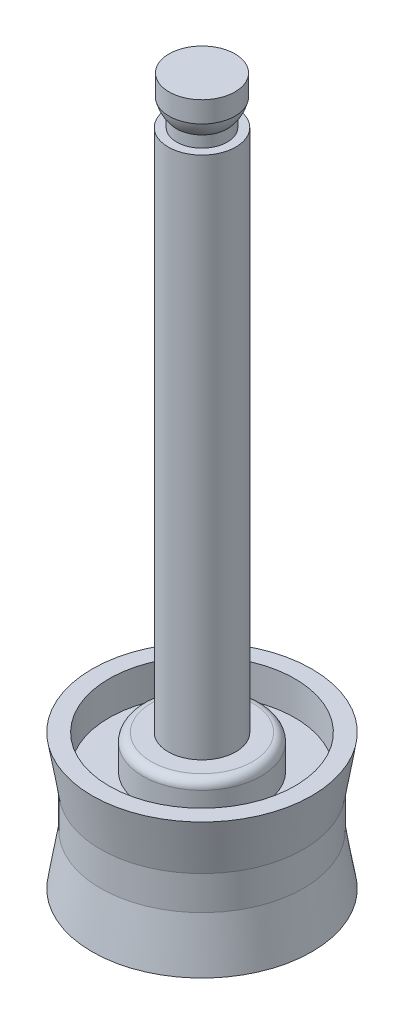
ISO-10303-21;
HEADER;
FILE_DESCRIPTION(('STEP AP214'),'2;1');
FILE_NAME('part.step','',(''),(''),'','','');
FILE_SCHEMA(('AUTOMOTIVE_DESIGN { 1 0 10303 214 1 1 1 1 }'));
ENDSEC;
DATA;
#1=APPLICATION_CONTEXT('core data for automotive mechanical design processes');
#2=APPLICATION_PROTOCOL_DEFINITION('international standard','automotive_design',2000,#1);
#3=PRODUCT_CONTEXT('',#1,'mechanical');
#4=PRODUCT('Part','Part','',(#3));
#5=PRODUCT_RELATED_PRODUCT_CATEGORY('part','',(#4));
#6=PRODUCT_DEFINITION_FORMATION('','',#4);
#7=PRODUCT_DEFINITION_CONTEXT('part definition',#1,'design');
#8=PRODUCT_DEFINITION('design','',#6,#7);
#9=PRODUCT_DEFINITION_SHAPE('','',#8);
#10=(LENGTH_UNIT() NAMED_UNIT(*) SI_UNIT(.MILLI.,.METRE.));
#11=(NAMED_UNIT(*) PLANE_ANGLE_UNIT() SI_UNIT($,.RADIAN.));
#12=(NAMED_UNIT(*) SI_UNIT($,.STERADIAN.) SOLID_ANGLE_UNIT());
#13=UNCERTAINTY_MEASURE_WITH_UNIT(LENGTH_MEASURE(1.E-05),#10,'distance_accuracy_value','');
#14=(GEOMETRIC_REPRESENTATION_CONTEXT(3) GLOBAL_UNCERTAINTY_ASSIGNED_CONTEXT((#13)) GLOBAL_UNIT_ASSIGNED_CONTEXT((#10,
#11,#12)) REPRESENTATION_CONTEXT('',''));
#15=CARTESIAN_POINT('',(0.,0.,0.));
#16=DIRECTION('',(0.,0.,1.));
#17=DIRECTION('',(1.,0.,0.));
#18=AXIS2_PLACEMENT_3D('',#15,#16,#17);
#19=CARTESIAN_POINT('',(0.,8.,0.));
#20=DIRECTION('',(0.,1.,0.));
#21=DIRECTION('',(0.,0.,1.));
#22=AXIS2_PLACEMENT_3D('',#19,#20,#21);
#23=PLANE('',#22);
#24=CARTESIAN_POINT('',(0.,8.,0.));
#25=DIRECTION('',(0.,1.,0.));
#26=DIRECTION('',(0.,0.,1.));
#27=AXIS2_PLACEMENT_3D('',#24,#25,#26);
#28=CIRCLE('',#27,5.5);
#29=CARTESIAN_POINT('',(0.,8.,5.5));
#30=VERTEX_POINT('',#29);
#31=EDGE_CURVE('E94',#30,#30,#28,.T.);
#32=ORIENTED_EDGE('',*,*,#31,.F.);
#33=EDGE_LOOP('',(#32));
#34=FACE_BOUND('',#33,.T.);
#35=CARTESIAN_POINT('',(0.,8.,0.));
#36=DIRECTION('',(0.,-1.,0.));
#37=DIRECTION('',(0.,0.,-1.));
#38=AXIS2_PLACEMENT_3D('',#35,#36,#37);
#39=CIRCLE('',#38,6.5);
#40=CARTESIAN_POINT('',(0.,8.,-6.5));
#41=VERTEX_POINT('',#40);
#42=EDGE_CURVE('E72',#41,#41,#39,.T.);
#43=ORIENTED_EDGE('',*,*,#42,.F.);
#44=EDGE_LOOP('',(#43));
#45=FACE_BOUND('',#44,.T.);
#46=ADVANCED_FACE('F34',(#34,#45),#23,.T.);
#47=CARTESIAN_POINT('',(0.,5.,0.));
#48=DIRECTION('',(0.,1.,0.));
#49=DIRECTION('',(0.,0.,1.));
#50=AXIS2_PLACEMENT_3D('',#47,#48,#49);
#51=CONICAL_SURFACE('',#50,6.,0.165148677414627);
#52=ORIENTED_EDGE('',*,*,#42,.T.);
#53=EDGE_LOOP('',(#52));
#54=FACE_BOUND('',#53,.T.);
#55=CARTESIAN_POINT('',(0.,5.,0.));
#56=DIRECTION('',(0.,-1.,0.));
#57=DIRECTION('',(0.,0.,-1.));
#58=AXIS2_PLACEMENT_3D('',#55,#56,#57);
#59=CIRCLE('',#58,6.);
#60=CARTESIAN_POINT('',(0.,5.,-6.));
#61=VERTEX_POINT('',#60);
#62=EDGE_CURVE('E81',#61,#61,#59,.T.);
#63=ORIENTED_EDGE('',*,*,#62,.F.);
#64=EDGE_LOOP('',(#63));
#65=FACE_BOUND('',#64,.T.);
#66=ADVANCED_FACE('F120',(#54,#65),#51,.T.);
#67=CARTESIAN_POINT('',(0.,0.,0.));
#68=DIRECTION('',(0.,-1.,0.));
#69=DIRECTION('',(0.,0.,-1.));
#70=AXIS2_PLACEMENT_3D('',#67,#68,#69);
#71=CONICAL_SURFACE('',#70,6.5,0.165148677414627);
#72=CARTESIAN_POINT('',(0.,3.,0.));
#73=DIRECTION('',(0.,-1.,0.));
#74=DIRECTION('',(0.,0.,-1.));
#75=AXIS2_PLACEMENT_3D('',#72,#73,#74);
#76=CIRCLE('',#75,6.);
#77=CARTESIAN_POINT('',(0.,3.,-6.));
#78=VERTEX_POINT('',#77);
#79=EDGE_CURVE('E78',#78,#78,#76,.T.);
#80=ORIENTED_EDGE('',*,*,#79,.T.);
#81=EDGE_LOOP('',(#80));
#82=FACE_BOUND('',#81,.T.);
#83=CARTESIAN_POINT('',(0.,0.,0.));
#84=DIRECTION('',(0.,-1.,0.));
#85=DIRECTION('',(0.,0.,-1.));
#86=AXIS2_PLACEMENT_3D('',#83,#84,#85);
#87=CIRCLE('',#86,6.5);
#88=CARTESIAN_POINT('',(0.,0.,-6.5));
#89=VERTEX_POINT('',#88);
#90=EDGE_CURVE('E75',#89,#89,#87,.T.);
#91=ORIENTED_EDGE('',*,*,#90,.F.);
#92=EDGE_LOOP('',(#91));
#93=FACE_BOUND('',#92,.T.);
#94=ADVANCED_FACE('F127',(#82,#93),#71,.T.);
#95=CARTESIAN_POINT('',(0.,0.,0.));
#96=DIRECTION('',(0.,-1.,0.));
#97=DIRECTION('',(0.,0.,-1.));
#98=AXIS2_PLACEMENT_3D('',#95,#96,#97);
#99=CYLINDRICAL_SURFACE('',#98,6.);
#100=ORIENTED_EDGE('',*,*,#62,.T.);
#101=EDGE_LOOP('',(#100));
#102=FACE_BOUND('',#101,.T.);
#103=ORIENTED_EDGE('',*,*,#79,.F.);
#104=EDGE_LOOP('',(#103));
#105=FACE_BOUND('',#104,.T.);
#106=ADVANCED_FACE('F131',(#102,#105),#99,.T.);
#107=CARTESIAN_POINT('',(0.,0.,0.));
#108=DIRECTION('',(0.,1.,0.));
#109=DIRECTION('',(0.,0.,1.));
#110=AXIS2_PLACEMENT_3D('',#107,#108,#109);
#111=PLANE('',#110);
#112=CARTESIAN_POINT('',(0.,0.,0.));
#113=DIRECTION('',(0.,-1.,0.));
#114=DIRECTION('',(0.,0.,-1.));
#115=AXIS2_PLACEMENT_3D('',#112,#113,#114);
#116=CIRCLE('',#115,5.5);
#117=CARTESIAN_POINT('',(0.,0.,-5.5));
#118=VERTEX_POINT('',#117);
#119=EDGE_CURVE('E85',#118,#118,#116,.T.);
#120=ORIENTED_EDGE('',*,*,#119,.F.);
#121=EDGE_LOOP('',(#120));
#122=FACE_BOUND('',#121,.T.);
#123=ORIENTED_EDGE('',*,*,#90,.T.);
#124=EDGE_LOOP('',(#123));
#125=FACE_BOUND('',#124,.T.);
#126=ADVANCED_FACE('F134',(#122,#125),#111,.F.);
#127=CARTESIAN_POINT('',(0.,2.,0.));
#128=DIRECTION('',(0.,-1.,0.));
#129=DIRECTION('',(0.,0.,-1.));
#130=AXIS2_PLACEMENT_3D('',#127,#128,#129);
#131=CYLINDRICAL_SURFACE('',#130,5.5);
#132=CARTESIAN_POINT('',(0.,2.,0.));
#133=DIRECTION('',(0.,-1.,0.));
#134=DIRECTION('',(0.,0.,-1.));
#135=AXIS2_PLACEMENT_3D('',#132,#133,#134);
#136=CIRCLE('',#135,5.5);
#137=CARTESIAN_POINT('',(0.,2.,-5.5));
#138=VERTEX_POINT('',#137);
#139=EDGE_CURVE('E84',#138,#138,#136,.T.);
#140=ORIENTED_EDGE('',*,*,#139,.F.);
#141=EDGE_LOOP('',(#140));
#142=FACE_BOUND('',#141,.T.);
#143=ORIENTED_EDGE('',*,*,#119,.T.);
#144=EDGE_LOOP('',(#143));
#145=FACE_BOUND('',#144,.T.);
#146=ADVANCED_FACE('F144',(#142,#145),#131,.F.);
#147=CARTESIAN_POINT('',(0.,2.,0.));
#148=DIRECTION('',(0.,-1.,0.));
#149=DIRECTION('',(0.,0.,-1.));
#150=AXIS2_PLACEMENT_3D('',#147,#148,#149);
#151=PLANE('',#150);
#152=CARTESIAN_POINT('',(0.,2.,0.));
#153=DIRECTION('',(0.,-1.,0.));
#154=DIRECTION('',(0.,0.,-1.));
#155=AXIS2_PLACEMENT_3D('',#152,#153,#154);
#156=CIRCLE('',#155,3.5);
#157=CARTESIAN_POINT('',(0.,2.,-3.5));
#158=VERTEX_POINT('',#157);
#159=EDGE_CURVE('E88',#158,#158,#156,.T.);
#160=ORIENTED_EDGE('',*,*,#159,.F.);
#161=EDGE_LOOP('',(#160));
#162=FACE_BOUND('',#161,.T.);
#163=ORIENTED_EDGE('',*,*,#139,.T.);
#164=EDGE_LOOP('',(#163));
#165=FACE_BOUND('',#164,.T.);
#166=ADVANCED_FACE('F150',(#162,#165),#151,.T.);
#167=CARTESIAN_POINT('',(0.,2.,0.));
#168=DIRECTION('',(0.,-1.,0.));
#169=DIRECTION('',(0.,0.,-1.));
#170=AXIS2_PLACEMENT_3D('',#167,#168,#169);
#171=CYLINDRICAL_SURFACE('',#170,3.5);
#172=CARTESIAN_POINT('',(0.,0.5,0.));
#173=DIRECTION('',(0.,1.,0.));
#174=DIRECTION('',(0.,0.,1.));
#175=AXIS2_PLACEMENT_3D('',#172,#173,#174);
#176=CIRCLE('',#175,3.5);
#177=CARTESIAN_POINT('',(0.,0.5,3.5));
#178=VERTEX_POINT('',#177);
#179=EDGE_CURVE('E45',#178,#178,#176,.T.);
#180=ORIENTED_EDGE('',*,*,#179,.T.);
#181=EDGE_LOOP('',(#180));
#182=FACE_BOUND('',#181,.T.);
#183=ORIENTED_EDGE('',*,*,#159,.T.);
#184=EDGE_LOOP('',(#183));
#185=FACE_BOUND('',#184,.T.);
#186=ADVANCED_FACE('F155',(#182,#185),#171,.T.);
#187=CARTESIAN_POINT('',(0.,0.,0.));
#188=DIRECTION('',(0.,1.,0.));
#189=DIRECTION('',(0.,0.,1.));
#190=AXIS2_PLACEMENT_3D('',#187,#188,#189);
#191=CIRCLE('',#190,3.);
#192=CARTESIAN_POINT('',(0.,0.,3.));
#193=VERTEX_POINT('',#192);
#194=EDGE_CURVE('E49',#193,#193,#191,.F.);
#195=ORIENTED_EDGE('',*,*,#194,.T.);
#196=EDGE_LOOP('',(#195));
#197=FACE_BOUND('',#196,.T.);
#198=ADVANCED_FACE('F114',(#197),#111,.F.);
#199=CARTESIAN_POINT('',(0.,6.,0.));
#200=DIRECTION('',(0.,1.,0.));
#201=DIRECTION('',(0.,0.,1.));
#202=AXIS2_PLACEMENT_3D('',#199,#200,#201);
#203=CYLINDRICAL_SURFACE('',#202,5.5);
#204=CARTESIAN_POINT('',(0.,6.,0.));
#205=DIRECTION('',(0.,1.,0.));
#206=DIRECTION('',(0.,0.,1.));
#207=AXIS2_PLACEMENT_3D('',#204,#205,#206);
#208=CIRCLE('',#207,5.5);
#209=CARTESIAN_POINT('',(0.,6.,5.5));
#210=VERTEX_POINT('',#209);
#211=EDGE_CURVE('E93',#210,#210,#208,.T.);
#212=ORIENTED_EDGE('',*,*,#211,.F.);
#213=EDGE_LOOP('',(#212));
#214=FACE_BOUND('',#213,.T.);
#215=ORIENTED_EDGE('',*,*,#31,.T.);
#216=EDGE_LOOP('',(#215));
#217=FACE_BOUND('',#216,.T.);
#218=ADVANCED_FACE('F108',(#214,#217),#203,.F.);
#219=CARTESIAN_POINT('',(0.,6.,0.));
#220=DIRECTION('',(0.,1.,0.));
#221=DIRECTION('',(0.,0.,1.));
#222=AXIS2_PLACEMENT_3D('',#219,#220,#221);
#223=PLANE('',#222);
#224=CARTESIAN_POINT('',(0.,6.,0.));
#225=DIRECTION('',(0.,1.,0.));
#226=DIRECTION('',(0.,0.,1.));
#227=AXIS2_PLACEMENT_3D('',#224,#225,#226);
#228=CIRCLE('',#227,3.5);
#229=CARTESIAN_POINT('',(0.,6.,3.5));
#230=VERTEX_POINT('',#229);
#231=EDGE_CURVE('E97',#230,#230,#228,.T.);
#232=ORIENTED_EDGE('',*,*,#231,.F.);
#233=EDGE_LOOP('',(#232));
#234=FACE_BOUND('',#233,.T.);
#235=ORIENTED_EDGE('',*,*,#211,.T.);
#236=EDGE_LOOP('',(#235));
#237=FACE_BOUND('',#236,.T.);
#238=ADVANCED_FACE('F105',(#234,#237),#223,.T.);
#239=CARTESIAN_POINT('',(0.,6.,0.));
#240=DIRECTION('',(0.,1.,0.));
#241=DIRECTION('',(0.,0.,1.));
#242=AXIS2_PLACEMENT_3D('',#239,#240,#241);
#243=CYLINDRICAL_SURFACE('',#242,3.5);
#244=CARTESIAN_POINT('',(0.,7.5,0.));
#245=DIRECTION('',(0.,1.,0.));
#246=DIRECTION('',(0.,0.,1.));
#247=AXIS2_PLACEMENT_3D('',#244,#245,#246);
#248=CIRCLE('',#247,3.5);
#249=CARTESIAN_POINT('',(0.,7.5,3.5));
#250=VERTEX_POINT('',#249);
#251=EDGE_CURVE('E10',#250,#250,#248,.F.);
#252=ORIENTED_EDGE('',*,*,#251,.T.);
#253=EDGE_LOOP('',(#252));
#254=FACE_BOUND('',#253,.T.);
#255=ORIENTED_EDGE('',*,*,#231,.T.);
#256=EDGE_LOOP('',(#255));
#257=FACE_BOUND('',#256,.T.);
#258=ADVANCED_FACE('F103',(#254,#257),#243,.T.);
#259=CARTESIAN_POINT('',(0.,41.8,0.));
#260=DIRECTION('',(0.,1.,0.));
#261=DIRECTION('',(0.,0.,1.));
#262=AXIS2_PLACEMENT_3D('',#259,#260,#261);
#263=PLANE('',#262);
#264=CARTESIAN_POINT('',(0.,41.8,0.));
#265=DIRECTION('',(0.,-1.,0.));
#266=DIRECTION('',(0.,0.,-1.));
#267=AXIS2_PLACEMENT_3D('',#264,#265,#266);
#268=CIRCLE('',#267,1.95);
#269=CARTESIAN_POINT('',(0.,41.8,-1.95));
#270=VERTEX_POINT('',#269);
#271=EDGE_CURVE('E69',#270,#270,#268,.T.);
#272=ORIENTED_EDGE('',*,*,#271,.F.);
#273=EDGE_LOOP('',(#272));
#274=FACE_BOUND('',#273,.T.);
#275=ADVANCED_FACE('F185',(#274),#263,.T.);
#276=CARTESIAN_POINT('',(0.,39.,0.));
#277=DIRECTION('',(0.,-1.,0.));
#278=DIRECTION('',(0.,0.,-1.));
#279=AXIS2_PLACEMENT_3D('',#276,#277,#278);
#280=CYLINDRICAL_SURFACE('',#279,1.95);
#281=ORIENTED_EDGE('',*,*,#271,.T.);
#282=EDGE_LOOP('',(#281));
#283=FACE_BOUND('',#282,.T.);
#284=CARTESIAN_POINT('',(0.,40.5555902791342,0.));
#285=DIRECTION('',(0.,-1.,0.));
#286=DIRECTION('',(0.,0.,-1.));
#287=AXIS2_PLACEMENT_3D('',#284,#285,#286);
#288=CIRCLE('',#287,1.95);
#289=CARTESIAN_POINT('',(1.95,40.5555902791342,0.));
#290=VERTEX_POINT('',#289);
#291=EDGE_CURVE('E66',#290,#290,#288,.T.);
#292=ORIENTED_EDGE('',*,*,#291,.F.);
#293=EDGE_LOOP('',(#292));
#294=FACE_BOUND('',#293,.T.);
#295=ADVANCED_FACE('F188',(#283,#294),#280,.T.);
#296=CARTESIAN_POINT('',(0.,41.,0.));
#297=DIRECTION('',(0.,-1.,0.));
#298=DIRECTION('',(1.,0.,0.));
#299=AXIS2_PLACEMENT_3D('',#296,#297,#298);
#300=SPHERICAL_SURFACE('',#299,2.);
#301=CARTESIAN_POINT('',(0.,39.6771243444677,0.));
#302=DIRECTION('',(0.,-1.,0.));
#303=DIRECTION('',(0.,0.,-1.));
#304=AXIS2_PLACEMENT_3D('',#301,#302,#303);
#305=CIRCLE('',#304,1.5);
#306=CARTESIAN_POINT('',(1.5,39.6771243444677,0.));
#307=VERTEX_POINT('',#306);
#308=EDGE_CURVE('E61',#307,#307,#305,.T.);
#309=CARTESIAN_POINT('',(1.95,40.5555902791342,0.));
#310=CARTESIAN_POINT('',(1.94769158091677,40.545461267286,0.));
#311=CARTESIAN_POINT('',(1.94530422770812,40.5353502449114,0.));
#312=CARTESIAN_POINT('',(1.94037226287277,40.5151666269883,0.));
#313=CARTESIAN_POINT('',(1.93782765124607,40.5050940314399,0.));
#314=CARTESIAN_POINT('',(1.93258177940741,40.4849897150477,0.));
#315=CARTESIAN_POINT('',(1.92988051919545,40.474957994204,0.));
#316=CARTESIAN_POINT('',(1.92432200828981,40.4549378626743,0.));
#317=CARTESIAN_POINT('',(1.92146475759613,40.4449494519884,0.));
#318=CARTESIAN_POINT('',(1.91559495896774,40.4250183663802,0.));
#319=CARTESIAN_POINT('',(1.91258241103302,40.4150756914579,0.));
#320=CARTESIAN_POINT('',(1.90640274960837,40.3952384916976,0.));
#321=CARTESIAN_POINT('',(1.90323563611844,40.3853439668596,0.));
#322=CARTESIAN_POINT('',(1.89674761260514,40.3656054699444,0.));
#323=CARTESIAN_POINT('',(1.89342670258178,40.3557614978671,0.));
#324=CARTESIAN_POINT('',(1.88663189242225,40.3361264968611,0.));
#325=CARTESIAN_POINT('',(1.88315799228608,40.3263354679325,0.));
#326=CARTESIAN_POINT('',(1.8760580454577,40.3068087307593,0.));
#327=CARTESIAN_POINT('',(1.87243199876548,40.2970730225146,0.));
#328=CARTESIAN_POINT('',(1.86502863933094,40.2776592908104,0.));
#329=CARTESIAN_POINT('',(1.86125132658863,40.2679812673507,0.));
#330=CARTESIAN_POINT('',(1.85354635229047,40.2486852553103,0.));
#331=CARTESIAN_POINT('',(1.84961869073462,40.2390672667295,0.));
#332=CARTESIAN_POINT('',(1.84161397255509,40.2198936599621,0.));
#333=CARTESIAN_POINT('',(1.83753691593141,40.2103380417757,0.));
#334=CARTESIAN_POINT('',(1.82923439763915,40.1912914961674,0.));
#335=CARTESIAN_POINT('',(1.82500893597056,40.1818005687456,0.));
#336=CARTESIAN_POINT('',(1.81641063364831,40.1628857093283,0.));
#337=CARTESIAN_POINT('',(1.81203779299464,40.1534617773328,0.));
#338=CARTESIAN_POINT('',(1.80314579454975,40.1346831971613,0.));
#339=CARTESIAN_POINT('',(1.79862663675853,40.1253285489853,0.));
#340=CARTESIAN_POINT('',(1.78944310141596,40.1066908080221,0.));
#341=CARTESIAN_POINT('',(1.78477872386462,40.0974077152348,0.));
#342=CARTESIAN_POINT('',(1.77530588164261,40.0789153392426,0.));
#343=CARTESIAN_POINT('',(1.77049741697195,40.0697060560376,0.));
#344=CARTESIAN_POINT('',(1.76073756814051,40.0513635354805,0.));
#345=CARTESIAN_POINT('',(1.75578618397973,40.0422302981284,0.));
#346=CARTESIAN_POINT('',(1.74574169850207,40.0240420870814,0.));
#347=CARTESIAN_POINT('',(1.74064859718519,40.0149871133865,0.));
#348=CARTESIAN_POINT('',(1.73032191414222,39.996957628454,0.));
#349=CARTESIAN_POINT('',(1.72508833241614,39.9879831172164,0.));
#350=CARTESIAN_POINT('',(1.71448195941421,39.9701167364596,0.));
#351=CARTESIAN_POINT('',(1.70910916813838,39.9612248669405,0.));
#352=CARTESIAN_POINT('',(1.69822568070036,39.9435259288145,0.));
#353=CARTESIAN_POINT('',(1.69271498453819,39.9347188602076,0.));
#354=CARTESIAN_POINT('',(1.68155702547802,39.9171916625077,0.));
#355=CARTESIAN_POINT('',(1.67590976258003,39.9084715334147,0.));
#356=CARTESIAN_POINT('',(1.66448004136116,39.8911203322326,0.));
#357=CARTESIAN_POINT('',(1.65869758304028,39.8824892601436,0.));
#358=CARTESIAN_POINT('',(1.646998875117,39.8653182688348,0.));
#359=CARTESIAN_POINT('',(1.64108262551459,39.8567783496151,0.));
#360=CARTESIAN_POINT('',(1.62911777166081,39.8397917377733,0.));
#361=CARTESIAN_POINT('',(1.62306916740944,39.8313450451512,0.));
#362=CARTESIAN_POINT('',(1.61084107301865,39.8145469376044,0.));
#363=CARTESIAN_POINT('',(1.60466158287923,39.8061955226797,0.));
#364=CARTESIAN_POINT('',(1.59217321729725,39.789589998456,0.));
#365=CARTESIAN_POINT('',(1.58586434185469,39.7813358891571,0.));
#366=CARTESIAN_POINT('',(1.57311873751568,39.7649269806165,0.));
#367=CARTESIAN_POINT('',(1.56668200861923,39.7567721813749,0.));
#368=CARTESIAN_POINT('',(1.55368226084294,39.7405638727739,0.));
#369=CARTESIAN_POINT('',(1.54711924196311,39.7325103634145,0.));
#370=CARTESIAN_POINT('',(1.53386850621172,39.7165065916406,0.));
#371=CARTESIAN_POINT('',(1.52718078934017,39.708556329226,0.));
#372=CARTESIAN_POINT('',(1.51368228788461,39.69276097649,0.));
#373=CARTESIAN_POINT('',(1.5068715033006,39.6849158861685,0.));
#374=CARTESIAN_POINT('',(1.5,39.6771243444677,0.));
#375=B_SPLINE_CURVE_WITH_KNOTS('',3,(#309,#310,#311,#312,#313,#314,#315,#316,#317,#318,#319,
#320,#321,#322,#323,#324,#325,#326,#327,#328,#329,#330,#331,#332,#333,#334,#335,#336,#337,#338,
#339,#340,#341,#342,#343,#344,#345,#346,#347,#348,#349,#350,#351,#352,#353,#354,#355,#356,#357,
#358,#359,#360,#361,#362,#363,#364,#365,#366,#367,#368,#369,#370,#371,#372,#373,#374),
.UNSPECIFIED.,.F.,.F.,(4,2,2,2,2,2,2,2,2,2,2,2,2,2,2,2,2,2,2,2,2,2,2,2,2,2,2,2,2,2,2,2,4),(0.,
0.0311658698174695,0.0623317396349332,0.0934976094523945,0.124663479269864,0.155829349087324,
0.186995218904791,0.218161088722253,0.249326958539724,0.280492828357185,0.311658698174652,
0.342824567992112,0.373990437809579,0.405156307627044,0.436322177444509,0.467488047261975,
0.498653917079437,0.529819786896902,0.560985656714367,0.59215152653183,0.623317396349295,
0.654483266166764,0.685649135984225,0.716815005801692,0.747980875619154,0.779146745436622,
0.810312615254084,0.841478485071549,0.872644354889013,0.903810224706479,0.934976094523946,
0.966141964341407,0.99730783415887),.UNSPECIFIED.);
#376=EDGE_CURVE('BSEAM192',#290,#307,#375,.T.);
#377=ORIENTED_EDGE('',*,*,#291,.T.);
#378=ORIENTED_EDGE('',*,*,#308,.F.);
#379=ORIENTED_EDGE('',*,*,#376,.T.);
#380=ORIENTED_EDGE('',*,*,#376,.F.);
#381=EDGE_LOOP('',(#377,#379,#378,#380));
#382=FACE_BOUND('',#381,.T.);
#383=ADVANCED_FACE('F192',(#382),#300,.T.);
#384=CARTESIAN_POINT('',(0.,39.,0.));
#385=DIRECTION('',(0.,-1.,0.));
#386=DIRECTION('',(0.,0.,-1.));
#387=AXIS2_PLACEMENT_3D('',#384,#385,#386);
#388=CYLINDRICAL_SURFACE('',#387,1.5);
#389=ORIENTED_EDGE('',*,*,#308,.T.);
#390=EDGE_LOOP('',(#389));
#391=FACE_BOUND('',#390,.T.);
#392=CARTESIAN_POINT('',(0.,39.,0.));
#393=DIRECTION('',(0.,1.,0.));
#394=DIRECTION('',(0.,0.,1.));
#395=AXIS2_PLACEMENT_3D('',#392,#393,#394);
#396=CIRCLE('',#395,1.5);
#397=CARTESIAN_POINT('',(0.,39.,1.5));
#398=VERTEX_POINT('',#397);
#399=EDGE_CURVE('E54',#398,#398,#396,.T.);
#400=ORIENTED_EDGE('',*,*,#399,.T.);
#401=EDGE_LOOP('',(#400));
#402=FACE_BOUND('',#401,.T.);
#403=ADVANCED_FACE('F196',(#391,#402),#388,.T.);
#404=CARTESIAN_POINT('',(0.,39.,0.));
#405=DIRECTION('',(0.,1.,0.));
#406=DIRECTION('',(0.,0.,1.));
#407=AXIS2_PLACEMENT_3D('',#404,#405,#406);
#408=PLANE('',#407);
#409=ORIENTED_EDGE('',*,*,#399,.F.);
#410=EDGE_LOOP('',(#409));
#411=FACE_BOUND('',#410,.T.);
#412=CARTESIAN_POINT('',(0.,39.,0.));
#413=DIRECTION('',(0.,1.,0.));
#414=DIRECTION('',(0.,0.,1.));
#415=AXIS2_PLACEMENT_3D('',#412,#413,#414);
#416=CIRCLE('',#415,2.);
#417=CARTESIAN_POINT('',(0.,39.,2.));
#418=VERTEX_POINT('',#417);
#419=EDGE_CURVE('E57',#418,#418,#416,.T.);
#420=ORIENTED_EDGE('',*,*,#419,.T.);
#421=EDGE_LOOP('',(#420));
#422=FACE_BOUND('',#421,.T.);
#423=ADVANCED_FACE('F200',(#411,#422),#408,.T.);
#424=CARTESIAN_POINT('',(0.,39.,0.));
#425=DIRECTION('',(0.,-1.,0.));
#426=DIRECTION('',(0.,0.,-1.));
#427=AXIS2_PLACEMENT_3D('',#424,#425,#426);
#428=CYLINDRICAL_SURFACE('',#427,2.);
#429=ORIENTED_EDGE('',*,*,#419,.F.);
#430=EDGE_LOOP('',(#429));
#431=FACE_BOUND('',#430,.T.);
#432=CARTESIAN_POINT('',(0.,8.,0.));
#433=DIRECTION('',(0.,1.,0.));
#434=DIRECTION('',(0.,0.,1.));
#435=AXIS2_PLACEMENT_3D('',#432,#433,#434);
#436=CIRCLE('',#435,2.);
#437=CARTESIAN_POINT('',(0.,8.,2.));
#438=VERTEX_POINT('',#437);
#439=EDGE_CURVE('E58',#438,#438,#436,.T.);
#440=ORIENTED_EDGE('',*,*,#439,.T.);
#441=EDGE_LOOP('',(#440));
#442=FACE_BOUND('',#441,.T.);
#443=ADVANCED_FACE('F172',(#431,#442),#428,.T.);
#444=CARTESIAN_POINT('',(0.,8.,0.));
#445=DIRECTION('',(0.,1.,0.));
#446=DIRECTION('',(0.,0.,1.));
#447=AXIS2_PLACEMENT_3D('',#444,#445,#446);
#448=CIRCLE('',#447,3.);
#449=CARTESIAN_POINT('',(0.,8.,3.));
#450=VERTEX_POINT('',#449);
#451=EDGE_CURVE('E41',#450,#450,#448,.T.);
#452=ORIENTED_EDGE('',*,*,#451,.T.);
#453=EDGE_LOOP('',(#452));
#454=FACE_BOUND('',#453,.T.);
#455=ORIENTED_EDGE('',*,*,#439,.F.);
#456=EDGE_LOOP('',(#455));
#457=FACE_BOUND('',#456,.T.);
#458=ADVANCED_FACE('F122',(#454,#457),#23,.T.);
#459=CARTESIAN_POINT('',(0.,0.5,0.));
#460=DIRECTION('',(0.,1.,0.));
#461=DIRECTION('',(0.,0.,1.));
#462=AXIS2_PLACEMENT_3D('',#459,#460,#461);
#463=TOROIDAL_SURFACE('',#462,3.,0.5);
#464=ORIENTED_EDGE('',*,*,#179,.F.);
#465=EDGE_LOOP('',(#464));
#466=FACE_BOUND('',#465,.T.);
#467=ORIENTED_EDGE('',*,*,#194,.F.);
#468=EDGE_LOOP('',(#467));
#469=FACE_BOUND('',#468,.T.);
#470=ADVANCED_FACE('F164',(#466,#469),#463,.T.);
#471=CARTESIAN_POINT('',(0.,7.5,0.));
#472=DIRECTION('',(0.,1.,0.));
#473=DIRECTION('',(0.,0.,1.));
#474=AXIS2_PLACEMENT_3D('',#471,#472,#473);
#475=TOROIDAL_SURFACE('',#474,3.,0.5);
#476=ORIENTED_EDGE('',*,*,#251,.F.);
#477=EDGE_LOOP('',(#476));
#478=FACE_BOUND('',#477,.T.);
#479=ORIENTED_EDGE('',*,*,#451,.F.);
#480=EDGE_LOOP('',(#479));
#481=FACE_BOUND('',#480,.T.);
#482=ADVANCED_FACE('F36',(#478,#481),#475,.T.);
#483=CLOSED_SHELL('',(#46,#66,#94,#106,#126,#146,#166,#186,#198,#218,#238,#258,#275,#295,#383,
#403,#423,#443,#458,#470,#482));
#484=MANIFOLD_SOLID_BREP('B2',#483);
#485=ADVANCED_BREP_SHAPE_REPRESENTATION('',(#18,#484),#14);
#486=SHAPE_DEFINITION_REPRESENTATION(#9,#485);
ENDSEC;
END-ISO-10303-21;
